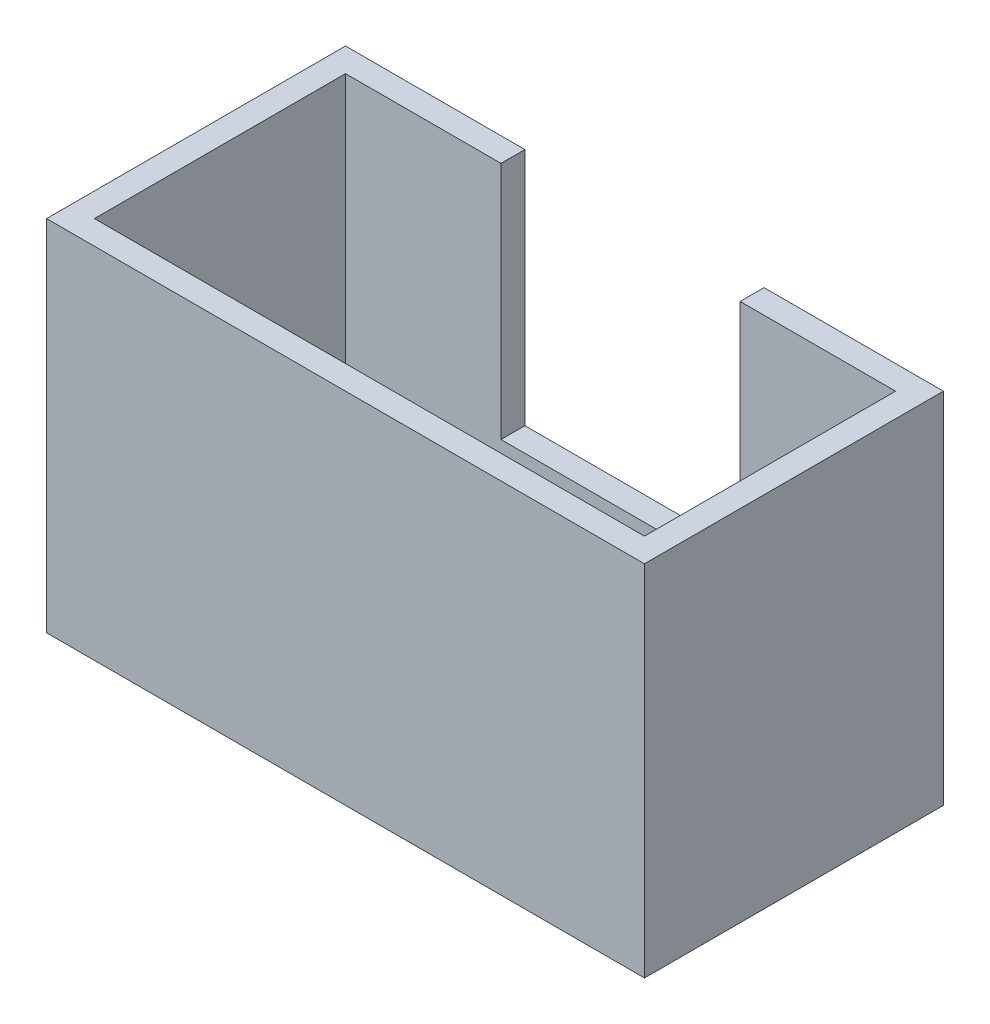
ISO-10303-21;
HEADER;
FILE_DESCRIPTION(('STEP AP214'),'2;1');
FILE_NAME('part.step','',(''),(''),'','','');
FILE_SCHEMA(('AUTOMOTIVE_DESIGN { 1 0 10303 214 1 1 1 1 }'));
ENDSEC;
DATA;
#1=APPLICATION_CONTEXT('core data for automotive mechanical design processes');
#2=APPLICATION_PROTOCOL_DEFINITION('international standard','automotive_design',2000,#1);
#3=PRODUCT_CONTEXT('',#1,'mechanical');
#4=PRODUCT('Part','Part','',(#3));
#5=PRODUCT_RELATED_PRODUCT_CATEGORY('part','',(#4));
#6=PRODUCT_DEFINITION_FORMATION('','',#4);
#7=PRODUCT_DEFINITION_CONTEXT('part definition',#1,'design');
#8=PRODUCT_DEFINITION('design','',#6,#7);
#9=PRODUCT_DEFINITION_SHAPE('','',#8);
#10=(LENGTH_UNIT() NAMED_UNIT(*) SI_UNIT(.MILLI.,.METRE.));
#11=(NAMED_UNIT(*) PLANE_ANGLE_UNIT() SI_UNIT($,.RADIAN.));
#12=(NAMED_UNIT(*) SI_UNIT($,.STERADIAN.) SOLID_ANGLE_UNIT());
#13=UNCERTAINTY_MEASURE_WITH_UNIT(LENGTH_MEASURE(1.E-05),#10,'distance_accuracy_value','');
#14=(GEOMETRIC_REPRESENTATION_CONTEXT(3) GLOBAL_UNCERTAINTY_ASSIGNED_CONTEXT((#13)) GLOBAL_UNIT_ASSIGNED_CONTEXT((#10,
#11,#12)) REPRESENTATION_CONTEXT('',''));
#15=CARTESIAN_POINT('',(0.,0.,0.));
#16=DIRECTION('',(0.,0.,1.));
#17=DIRECTION('',(1.,0.,0.));
#18=AXIS2_PLACEMENT_3D('',#15,#16,#17);
#19=CARTESIAN_POINT('',(0.,6.,5.));
#20=DIRECTION('',(0.,-1.,0.));
#21=DIRECTION('',(0.,0.,-1.));
#22=AXIS2_PLACEMENT_3D('',#19,#20,#21);
#23=PLANE('',#22);
#24=DIRECTION('',(-1.,0.,0.));
#25=VECTOR('',#24,1.);
#26=CARTESIAN_POINT('',(0.,6.,0.));
#27=LINE('',#26,#25);
#28=CARTESIAN_POINT('',(10.,6.,0.));
#29=VERTEX_POINT('',#28);
#30=CARTESIAN_POINT('',(7.,6.,0.));
#31=VERTEX_POINT('',#30);
#32=EDGE_CURVE('E146',#29,#31,#27,.T.);
#33=ORIENTED_EDGE('',*,*,#32,.T.);
#34=DIRECTION('',(0.,0.,-1.));
#35=VECTOR('',#34,1.);
#36=CARTESIAN_POINT('',(7.,6.,5.001));
#37=LINE('',#36,#35);
#38=CARTESIAN_POINT('',(7.,6.,0.4));
#39=VERTEX_POINT('',#38);
#40=EDGE_CURVE('E130',#39,#31,#37,.T.);
#41=ORIENTED_EDGE('',*,*,#40,.F.);
#42=DIRECTION('',(-1.,0.,0.));
#43=VECTOR('',#42,1.);
#44=CARTESIAN_POINT('',(0.,6.,0.4));
#45=LINE('',#44,#43);
#46=CARTESIAN_POINT('',(9.6,6.,0.4));
#47=VERTEX_POINT('',#46);
#48=EDGE_CURVE('E143',#47,#39,#45,.T.);
#49=ORIENTED_EDGE('',*,*,#48,.F.);
#50=DIRECTION('',(0.,0.,-1.));
#51=VECTOR('',#50,1.);
#52=CARTESIAN_POINT('',(9.6,6.,5.));
#53=LINE('',#52,#51);
#54=CARTESIAN_POINT('',(9.6,6.,4.6));
#55=VERTEX_POINT('',#54);
#56=EDGE_CURVE('E161',#55,#47,#53,.T.);
#57=ORIENTED_EDGE('',*,*,#56,.F.);
#58=DIRECTION('',(-1.,0.,0.));
#59=VECTOR('',#58,1.);
#60=CARTESIAN_POINT('',(0.,6.,4.6));
#61=LINE('',#60,#59);
#62=CARTESIAN_POINT('',(0.4,6.,4.6));
#63=VERTEX_POINT('',#62);
#64=EDGE_CURVE('E58',#55,#63,#61,.T.);
#65=ORIENTED_EDGE('',*,*,#64,.T.);
#66=DIRECTION('',(0.,0.,-1.));
#67=VECTOR('',#66,1.);
#68=CARTESIAN_POINT('',(0.4,6.,5.));
#69=LINE('',#68,#67);
#70=CARTESIAN_POINT('',(0.4,6.,0.4));
#71=VERTEX_POINT('',#70);
#72=EDGE_CURVE('E227',#63,#71,#69,.T.);
#73=ORIENTED_EDGE('',*,*,#72,.T.);
#74=CARTESIAN_POINT('',(3.,6.,0.4));
#75=VERTEX_POINT('',#74);
#76=EDGE_CURVE('E154',#75,#71,#45,.T.);
#77=ORIENTED_EDGE('',*,*,#76,.F.);
#78=DIRECTION('',(0.,0.,-1.));
#79=VECTOR('',#78,1.);
#80=CARTESIAN_POINT('',(3.,6.,5.001));
#81=LINE('',#80,#79);
#82=CARTESIAN_POINT('',(3.,6.,0.));
#83=VERTEX_POINT('',#82);
#84=EDGE_CURVE('E50',#75,#83,#81,.T.);
#85=ORIENTED_EDGE('',*,*,#84,.T.);
#86=CARTESIAN_POINT('',(0.,6.,0.));
#87=VERTEX_POINT('',#86);
#88=EDGE_CURVE('E181',#83,#87,#27,.T.);
#89=ORIENTED_EDGE('',*,*,#88,.T.);
#90=DIRECTION('',(0.,0.,-1.));
#91=VECTOR('',#90,1.);
#92=CARTESIAN_POINT('',(0.,6.,5.));
#93=LINE('',#92,#91);
#94=CARTESIAN_POINT('',(0.,6.,5.));
#95=VERTEX_POINT('',#94);
#96=EDGE_CURVE('E172',#95,#87,#93,.T.);
#97=ORIENTED_EDGE('',*,*,#96,.F.);
#98=DIRECTION('',(-1.,0.,0.));
#99=VECTOR('',#98,1.);
#100=CARTESIAN_POINT('',(0.,6.,5.));
#101=LINE('',#100,#99);
#102=CARTESIAN_POINT('',(10.,6.,5.));
#103=VERTEX_POINT('',#102);
#104=EDGE_CURVE('E170',#103,#95,#101,.T.);
#105=ORIENTED_EDGE('',*,*,#104,.F.);
#106=DIRECTION('',(0.,0.,-1.));
#107=VECTOR('',#106,1.);
#108=CARTESIAN_POINT('',(10.,6.,5.));
#109=LINE('',#108,#107);
#110=EDGE_CURVE('E185',#103,#29,#109,.T.);
#111=ORIENTED_EDGE('',*,*,#110,.T.);
#112=EDGE_LOOP('',(#33,#41,#49,#57,#65,#73,#77,#85,#89,#97,#105,#111));
#113=FACE_BOUND('',#112,.T.);
#114=ADVANCED_FACE('F35',(#113),#23,.F.);
#115=CARTESIAN_POINT('',(0.,0.,5.));
#116=DIRECTION('',(1.,0.,0.));
#117=DIRECTION('',(0.,0.,-1.));
#118=AXIS2_PLACEMENT_3D('',#115,#116,#117);
#119=PLANE('',#118);
#120=DIRECTION('',(0.,-1.,0.));
#121=VECTOR('',#120,1.);
#122=CARTESIAN_POINT('',(0.,0.,0.));
#123=LINE('',#122,#121);
#124=CARTESIAN_POINT('',(0.,0.,0.));
#125=VERTEX_POINT('',#124);
#126=EDGE_CURVE('E173',#87,#125,#123,.T.);
#127=ORIENTED_EDGE('',*,*,#126,.T.);
#128=DIRECTION('',(0.,0.,-1.));
#129=VECTOR('',#128,1.);
#130=CARTESIAN_POINT('',(0.,0.,5.));
#131=LINE('',#130,#129);
#132=CARTESIAN_POINT('',(0.,0.,5.));
#133=VERTEX_POINT('',#132);
#134=EDGE_CURVE('E11',#133,#125,#131,.T.);
#135=ORIENTED_EDGE('',*,*,#134,.F.);
#136=DIRECTION('',(0.,-1.,0.));
#137=VECTOR('',#136,1.);
#138=CARTESIAN_POINT('',(0.,0.,5.));
#139=LINE('',#138,#137);
#140=EDGE_CURVE('E163',#95,#133,#139,.T.);
#141=ORIENTED_EDGE('',*,*,#140,.F.);
#142=ORIENTED_EDGE('',*,*,#96,.T.);
#143=EDGE_LOOP('',(#127,#135,#141,#142));
#144=FACE_BOUND('',#143,.T.);
#145=ADVANCED_FACE('F37',(#144),#119,.F.);
#146=CARTESIAN_POINT('',(0.,0.,5.));
#147=DIRECTION('',(0.,1.,0.));
#148=DIRECTION('',(0.,0.,1.));
#149=AXIS2_PLACEMENT_3D('',#146,#147,#148);
#150=PLANE('',#149);
#151=DIRECTION('',(1.,0.,0.));
#152=VECTOR('',#151,1.);
#153=CARTESIAN_POINT('',(0.,0.,0.));
#154=LINE('',#153,#152);
#155=CARTESIAN_POINT('',(9.99999999999999,0.,0.));
#156=VERTEX_POINT('',#155);
#157=EDGE_CURVE('E176',#125,#156,#154,.T.);
#158=ORIENTED_EDGE('',*,*,#157,.T.);
#159=DIRECTION('',(0.,0.,-1.));
#160=VECTOR('',#159,1.);
#161=CARTESIAN_POINT('',(9.99999999999999,0.,5.));
#162=LINE('',#161,#160);
#163=CARTESIAN_POINT('',(9.99999999999999,0.,5.));
#164=VERTEX_POINT('',#163);
#165=EDGE_CURVE('E43',#164,#156,#162,.T.);
#166=ORIENTED_EDGE('',*,*,#165,.F.);
#167=DIRECTION('',(1.,0.,0.));
#168=VECTOR('',#167,1.);
#169=CARTESIAN_POINT('',(0.,0.,5.));
#170=LINE('',#169,#168);
#171=EDGE_CURVE('E166',#133,#164,#170,.T.);
#172=ORIENTED_EDGE('',*,*,#171,.F.);
#173=ORIENTED_EDGE('',*,*,#134,.T.);
#174=EDGE_LOOP('',(#158,#166,#172,#173));
#175=FACE_BOUND('',#174,.T.);
#176=ADVANCED_FACE('F248',(#175),#150,.F.);
#177=CARTESIAN_POINT('',(9.99999999999999,0.,5.));
#178=DIRECTION('',(-1.,0.,0.));
#179=DIRECTION('',(0.,-1.,0.));
#180=AXIS2_PLACEMENT_3D('',#177,#178,#179);
#181=PLANE('',#180);
#182=DIRECTION('',(0.,1.,0.));
#183=VECTOR('',#182,1.);
#184=CARTESIAN_POINT('',(9.99999999999999,0.,0.));
#185=LINE('',#184,#183);
#186=EDGE_CURVE('E179',#156,#29,#185,.T.);
#187=ORIENTED_EDGE('',*,*,#186,.T.);
#188=ORIENTED_EDGE('',*,*,#110,.F.);
#189=DIRECTION('',(0.,1.,0.));
#190=VECTOR('',#189,1.);
#191=CARTESIAN_POINT('',(9.99999999999999,0.,5.));
#192=LINE('',#191,#190);
#193=EDGE_CURVE('E168',#164,#103,#192,.T.);
#194=ORIENTED_EDGE('',*,*,#193,.F.);
#195=ORIENTED_EDGE('',*,*,#165,.T.);
#196=EDGE_LOOP('',(#187,#188,#194,#195));
#197=FACE_BOUND('',#196,.T.);
#198=ADVANCED_FACE('F191',(#197),#181,.F.);
#199=CARTESIAN_POINT('',(0.,6.,5.));
#200=DIRECTION('',(0.,0.,-1.));
#201=DIRECTION('',(-1.,0.,0.));
#202=AXIS2_PLACEMENT_3D('',#199,#200,#201);
#203=PLANE('',#202);
#204=ORIENTED_EDGE('',*,*,#140,.T.);
#205=ORIENTED_EDGE('',*,*,#171,.T.);
#206=ORIENTED_EDGE('',*,*,#193,.T.);
#207=ORIENTED_EDGE('',*,*,#104,.T.);
#208=EDGE_LOOP('',(#204,#205,#206,#207));
#209=FACE_BOUND('',#208,.T.);
#210=ADVANCED_FACE('F247',(#209),#203,.F.);
#211=CARTESIAN_POINT('',(0.,6.,0.));
#212=DIRECTION('',(0.,0.,-1.));
#213=DIRECTION('',(-1.,0.,0.));
#214=AXIS2_PLACEMENT_3D('',#211,#212,#213);
#215=PLANE('',#214);
#216=DIRECTION('',(0.,-1.,0.));
#217=VECTOR('',#216,1.);
#218=CARTESIAN_POINT('',(7.,6.,0.));
#219=LINE('',#218,#217);
#220=CARTESIAN_POINT('',(7.,2.,0.));
#221=VERTEX_POINT('',#220);
#222=EDGE_CURVE('E198',#31,#221,#219,.T.);
#223=ORIENTED_EDGE('',*,*,#222,.F.);
#224=ORIENTED_EDGE('',*,*,#32,.F.);
#225=ORIENTED_EDGE('',*,*,#186,.F.);
#226=ORIENTED_EDGE('',*,*,#157,.F.);
#227=ORIENTED_EDGE('',*,*,#126,.F.);
#228=ORIENTED_EDGE('',*,*,#88,.F.);
#229=DIRECTION('',(0.,1.,0.));
#230=VECTOR('',#229,1.);
#231=CARTESIAN_POINT('',(3.,6.,0.));
#232=LINE('',#231,#230);
#233=CARTESIAN_POINT('',(3.,2.,0.));
#234=VERTEX_POINT('',#233);
#235=EDGE_CURVE('E147',#234,#83,#232,.T.);
#236=ORIENTED_EDGE('',*,*,#235,.F.);
#237=DIRECTION('',(-1.,0.,0.));
#238=VECTOR('',#237,1.);
#239=CARTESIAN_POINT('',(7.,2.,0.));
#240=LINE('',#239,#238);
#241=EDGE_CURVE('E201',#221,#234,#240,.T.);
#242=ORIENTED_EDGE('',*,*,#241,.F.);
#243=EDGE_LOOP('',(#223,#224,#225,#226,#227,#228,#236,#242));
#244=FACE_BOUND('',#243,.T.);
#245=ADVANCED_FACE('F195',(#244),#215,.T.);
#246=CARTESIAN_POINT('',(0.4,0.,5.));
#247=DIRECTION('',(1.,0.,0.));
#248=DIRECTION('',(0.,0.,-1.));
#249=AXIS2_PLACEMENT_3D('',#246,#247,#248);
#250=PLANE('',#249);
#251=DIRECTION('',(0.,-1.,0.));
#252=VECTOR('',#251,1.);
#253=CARTESIAN_POINT('',(0.4,6.,0.4));
#254=LINE('',#253,#252);
#255=CARTESIAN_POINT('',(0.4,0.4,0.4));
#256=VERTEX_POINT('',#255);
#257=EDGE_CURVE('E137',#71,#256,#254,.T.);
#258=ORIENTED_EDGE('',*,*,#257,.F.);
#259=ORIENTED_EDGE('',*,*,#72,.F.);
#260=DIRECTION('',(0.,-1.,0.));
#261=VECTOR('',#260,1.);
#262=CARTESIAN_POINT('',(0.4,6.,4.6));
#263=LINE('',#262,#261);
#264=CARTESIAN_POINT('',(0.4,0.4,4.6));
#265=VERTEX_POINT('',#264);
#266=EDGE_CURVE('E153',#63,#265,#263,.T.);
#267=ORIENTED_EDGE('',*,*,#266,.T.);
#268=DIRECTION('',(0.,0.,-1.));
#269=VECTOR('',#268,1.);
#270=CARTESIAN_POINT('',(0.4,0.4,5.));
#271=LINE('',#270,#269);
#272=EDGE_CURVE('E177',#265,#256,#271,.T.);
#273=ORIENTED_EDGE('',*,*,#272,.T.);
#274=EDGE_LOOP('',(#258,#259,#267,#273));
#275=FACE_BOUND('',#274,.T.);
#276=ADVANCED_FACE('F238',(#275),#250,.T.);
#277=CARTESIAN_POINT('',(0.,0.4,5.));
#278=DIRECTION('',(0.,1.,0.));
#279=DIRECTION('',(0.,0.,1.));
#280=AXIS2_PLACEMENT_3D('',#277,#278,#279);
#281=PLANE('',#280);
#282=DIRECTION('',(1.,0.,0.));
#283=VECTOR('',#282,1.);
#284=CARTESIAN_POINT('',(0.,0.4,0.4));
#285=LINE('',#284,#283);
#286=CARTESIAN_POINT('',(9.6,0.4,0.4));
#287=VERTEX_POINT('',#286);
#288=EDGE_CURVE('E216',#256,#287,#285,.T.);
#289=ORIENTED_EDGE('',*,*,#288,.F.);
#290=ORIENTED_EDGE('',*,*,#272,.F.);
#291=DIRECTION('',(1.,0.,0.));
#292=VECTOR('',#291,1.);
#293=CARTESIAN_POINT('',(0.,0.4,4.6));
#294=LINE('',#293,#292);
#295=CARTESIAN_POINT('',(9.6,0.4,4.6));
#296=VERTEX_POINT('',#295);
#297=EDGE_CURVE('E157',#265,#296,#294,.T.);
#298=ORIENTED_EDGE('',*,*,#297,.T.);
#299=DIRECTION('',(0.,0.,-1.));
#300=VECTOR('',#299,1.);
#301=CARTESIAN_POINT('',(9.6,0.4,5.));
#302=LINE('',#301,#300);
#303=EDGE_CURVE('E218',#296,#287,#302,.T.);
#304=ORIENTED_EDGE('',*,*,#303,.T.);
#305=EDGE_LOOP('',(#289,#290,#298,#304));
#306=FACE_BOUND('',#305,.T.);
#307=ADVANCED_FACE('F239',(#306),#281,.T.);
#308=CARTESIAN_POINT('',(9.6,0.,5.));
#309=DIRECTION('',(-1.,0.,0.));
#310=DIRECTION('',(0.,-1.,0.));
#311=AXIS2_PLACEMENT_3D('',#308,#309,#310);
#312=PLANE('',#311);
#313=DIRECTION('',(0.,1.,0.));
#314=VECTOR('',#313,1.);
#315=CARTESIAN_POINT('',(9.6,5.99999999999999,0.4));
#316=LINE('',#315,#314);
#317=EDGE_CURVE('E151',#287,#47,#316,.T.);
#318=ORIENTED_EDGE('',*,*,#317,.F.);
#319=ORIENTED_EDGE('',*,*,#303,.F.);
#320=DIRECTION('',(0.,1.,0.));
#321=VECTOR('',#320,1.);
#322=CARTESIAN_POINT('',(9.6,5.99999999999999,4.6));
#323=LINE('',#322,#321);
#324=EDGE_CURVE('E224',#296,#55,#323,.T.);
#325=ORIENTED_EDGE('',*,*,#324,.T.);
#326=ORIENTED_EDGE('',*,*,#56,.T.);
#327=EDGE_LOOP('',(#318,#319,#325,#326));
#328=FACE_BOUND('',#327,.T.);
#329=ADVANCED_FACE('F231',(#328),#312,.T.);
#330=CARTESIAN_POINT('',(0.,6.,4.6));
#331=DIRECTION('',(0.,0.,-1.));
#332=DIRECTION('',(-1.,0.,0.));
#333=AXIS2_PLACEMENT_3D('',#330,#331,#332);
#334=PLANE('',#333);
#335=ORIENTED_EDGE('',*,*,#266,.F.);
#336=ORIENTED_EDGE('',*,*,#64,.F.);
#337=ORIENTED_EDGE('',*,*,#324,.F.);
#338=ORIENTED_EDGE('',*,*,#297,.F.);
#339=EDGE_LOOP('',(#335,#336,#337,#338));
#340=FACE_BOUND('',#339,.T.);
#341=ADVANCED_FACE('F233',(#340),#334,.T.);
#342=CARTESIAN_POINT('',(0.,6.,0.4));
#343=DIRECTION('',(0.,0.,-1.));
#344=DIRECTION('',(-1.,0.,0.));
#345=AXIS2_PLACEMENT_3D('',#342,#343,#344);
#346=PLANE('',#345);
#347=ORIENTED_EDGE('',*,*,#48,.T.);
#348=DIRECTION('',(0.,1.,0.));
#349=VECTOR('',#348,1.);
#350=CARTESIAN_POINT('',(7.,6.,0.4));
#351=LINE('',#350,#349);
#352=CARTESIAN_POINT('',(7.,2.,0.4));
#353=VERTEX_POINT('',#352);
#354=EDGE_CURVE('E126',#353,#39,#351,.T.);
#355=ORIENTED_EDGE('',*,*,#354,.F.);
#356=DIRECTION('',(1.,0.,0.));
#357=VECTOR('',#356,1.);
#358=CARTESIAN_POINT('',(7.,2.,0.4));
#359=LINE('',#358,#357);
#360=CARTESIAN_POINT('',(3.,2.,0.4));
#361=VERTEX_POINT('',#360);
#362=EDGE_CURVE('E205',#361,#353,#359,.T.);
#363=ORIENTED_EDGE('',*,*,#362,.F.);
#364=DIRECTION('',(0.,-1.,0.));
#365=VECTOR('',#364,1.);
#366=CARTESIAN_POINT('',(3.,6.,0.4));
#367=LINE('',#366,#365);
#368=EDGE_CURVE('E202',#75,#361,#367,.T.);
#369=ORIENTED_EDGE('',*,*,#368,.F.);
#370=ORIENTED_EDGE('',*,*,#76,.T.);
#371=ORIENTED_EDGE('',*,*,#257,.T.);
#372=ORIENTED_EDGE('',*,*,#288,.T.);
#373=ORIENTED_EDGE('',*,*,#317,.T.);
#374=EDGE_LOOP('',(#347,#355,#363,#369,#370,#371,#372,#373));
#375=FACE_BOUND('',#374,.T.);
#376=ADVANCED_FACE('F149',(#375),#346,.F.);
#377=CARTESIAN_POINT('',(7.,6.,5.001));
#378=DIRECTION('',(1.,0.,0.));
#379=DIRECTION('',(0.,1.,0.));
#380=AXIS2_PLACEMENT_3D('',#377,#378,#379);
#381=PLANE('',#380);
#382=ORIENTED_EDGE('',*,*,#354,.T.);
#383=ORIENTED_EDGE('',*,*,#40,.T.);
#384=ORIENTED_EDGE('',*,*,#222,.T.);
#385=DIRECTION('',(0.,0.,-1.));
#386=VECTOR('',#385,1.);
#387=CARTESIAN_POINT('',(7.,2.,5.001));
#388=LINE('',#387,#386);
#389=EDGE_CURVE('E132',#353,#221,#388,.T.);
#390=ORIENTED_EDGE('',*,*,#389,.F.);
#391=EDGE_LOOP('',(#382,#383,#384,#390));
#392=FACE_BOUND('',#391,.T.);
#393=ADVANCED_FACE('F128',(#392),#381,.F.);
#394=CARTESIAN_POINT('',(7.,2.,5.001));
#395=DIRECTION('',(0.,-1.,0.));
#396=DIRECTION('',(1.,0.,0.));
#397=AXIS2_PLACEMENT_3D('',#394,#395,#396);
#398=PLANE('',#397);
#399=ORIENTED_EDGE('',*,*,#362,.T.);
#400=ORIENTED_EDGE('',*,*,#389,.T.);
#401=ORIENTED_EDGE('',*,*,#241,.T.);
#402=DIRECTION('',(0.,0.,-1.));
#403=VECTOR('',#402,1.);
#404=CARTESIAN_POINT('',(3.,2.,5.001));
#405=LINE('',#404,#403);
#406=EDGE_CURVE('E211',#361,#234,#405,.T.);
#407=ORIENTED_EDGE('',*,*,#406,.F.);
#408=EDGE_LOOP('',(#399,#400,#401,#407));
#409=FACE_BOUND('',#408,.T.);
#410=ADVANCED_FACE('F276',(#409),#398,.F.);
#411=CARTESIAN_POINT('',(3.,6.,5.001));
#412=DIRECTION('',(-1.,0.,0.));
#413=DIRECTION('',(0.,-1.,0.));
#414=AXIS2_PLACEMENT_3D('',#411,#412,#413);
#415=PLANE('',#414);
#416=ORIENTED_EDGE('',*,*,#368,.T.);
#417=ORIENTED_EDGE('',*,*,#406,.T.);
#418=ORIENTED_EDGE('',*,*,#235,.T.);
#419=ORIENTED_EDGE('',*,*,#84,.F.);
#420=EDGE_LOOP('',(#416,#417,#418,#419));
#421=FACE_BOUND('',#420,.T.);
#422=ADVANCED_FACE('F279',(#421),#415,.F.);
#423=CLOSED_SHELL('',(#114,#145,#176,#198,#210,#245,#276,#307,#329,#341,#376,#393,#410,#422));
#424=MANIFOLD_SOLID_BREP('B2',#423);
#425=ADVANCED_BREP_SHAPE_REPRESENTATION('',(#18,#424),#14);
#426=SHAPE_DEFINITION_REPRESENTATION(#9,#425);
ENDSEC;
END-ISO-10303-21;
